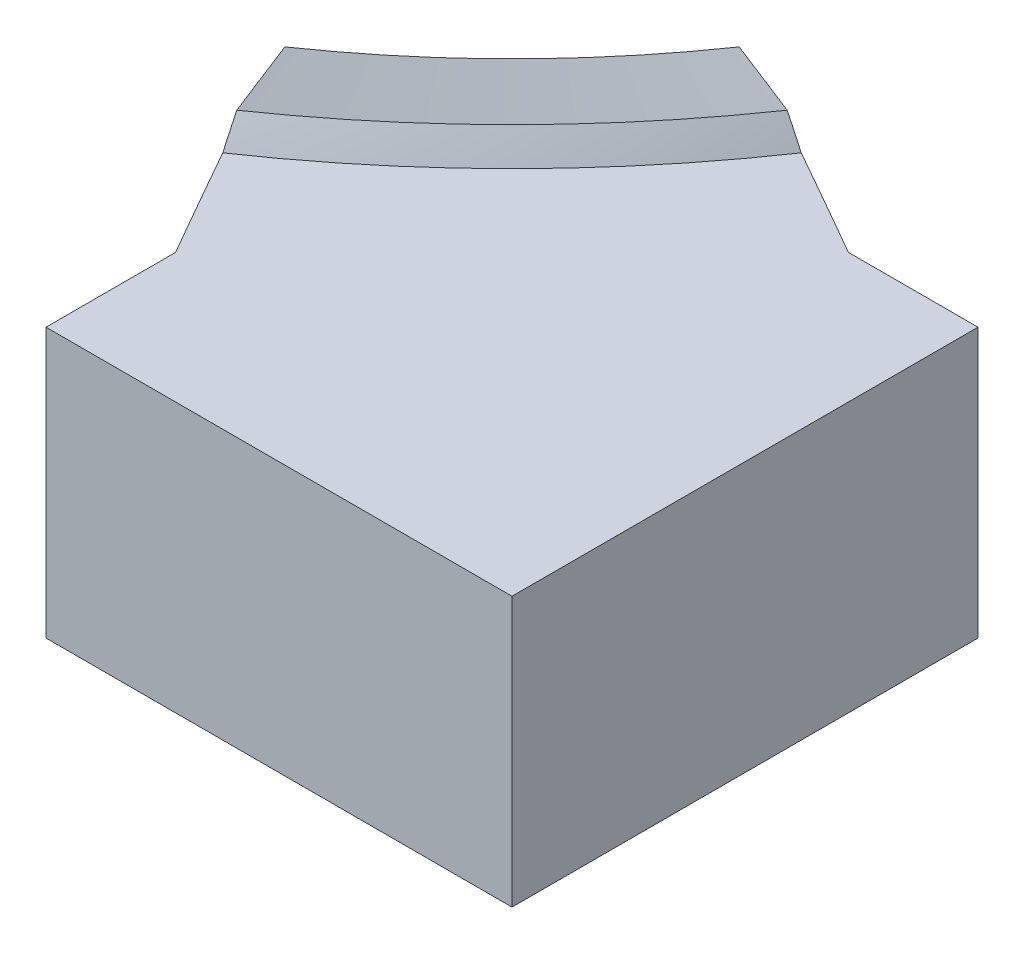
ISO-10303-21;
HEADER;
FILE_DESCRIPTION(('STEP AP214'),'2;1');
FILE_NAME('part.step','',(''),(''),'','','');
FILE_SCHEMA(('AUTOMOTIVE_DESIGN { 1 0 10303 214 1 1 1 1 }'));
ENDSEC;
DATA;
#1=APPLICATION_CONTEXT('core data for automotive mechanical design processes');
#2=APPLICATION_PROTOCOL_DEFINITION('international standard','automotive_design',2000,#1);
#3=PRODUCT_CONTEXT('',#1,'mechanical');
#4=PRODUCT('Part','Part','',(#3));
#5=PRODUCT_RELATED_PRODUCT_CATEGORY('part','',(#4));
#6=PRODUCT_DEFINITION_FORMATION('','',#4);
#7=PRODUCT_DEFINITION_CONTEXT('part definition',#1,'design');
#8=PRODUCT_DEFINITION('design','',#6,#7);
#9=PRODUCT_DEFINITION_SHAPE('','',#8);
#10=(LENGTH_UNIT() NAMED_UNIT(*) SI_UNIT(.MILLI.,.METRE.));
#11=(NAMED_UNIT(*) PLANE_ANGLE_UNIT() SI_UNIT($,.RADIAN.));
#12=(NAMED_UNIT(*) SI_UNIT($,.STERADIAN.) SOLID_ANGLE_UNIT());
#13=UNCERTAINTY_MEASURE_WITH_UNIT(LENGTH_MEASURE(1.E-05),#10,'distance_accuracy_value','');
#14=(GEOMETRIC_REPRESENTATION_CONTEXT(3) GLOBAL_UNCERTAINTY_ASSIGNED_CONTEXT((#13)) GLOBAL_UNIT_ASSIGNED_CONTEXT((#10,
#11,#12)) REPRESENTATION_CONTEXT('',''));
#15=CARTESIAN_POINT('',(0.,0.,0.));
#16=DIRECTION('',(0.,0.,1.));
#17=DIRECTION('',(1.,0.,0.));
#18=AXIS2_PLACEMENT_3D('',#15,#16,#17);
#19=CARTESIAN_POINT('',(32.5,11.7000000000001,0.));
#20=DIRECTION('',(0.,-1.,0.));
#21=DIRECTION('',(0.,0.,-1.));
#22=AXIS2_PLACEMENT_3D('',#19,#20,#21);
#23=PLANE('',#22);
#24=DIRECTION('',(0.,0.,-1.));
#25=VECTOR('',#24,1.);
#26=CARTESIAN_POINT('',(33.,11.7000000000001,-33.));
#27=LINE('',#26,#25);
#28=CARTESIAN_POINT('',(33.,11.7000000000001,33.));
#29=VERTEX_POINT('',#28);
#30=CARTESIAN_POINT('',(33.,11.7000000000001,19.5000000000001));
#31=VERTEX_POINT('',#30);
#32=EDGE_CURVE('E275',#29,#31,#27,.T.);
#33=ORIENTED_EDGE('',*,*,#32,.T.);
#34=DIRECTION('',(1.,0.,0.));
#35=VECTOR('',#34,1.);
#36=CARTESIAN_POINT('',(32.5,11.7000000000001,19.5000000000001));
#37=LINE('',#36,#35);
#38=CARTESIAN_POINT('',(29.2465382566893,11.7000000000001,19.5000000000001));
#39=VERTEX_POINT('',#38);
#40=EDGE_CURVE('E138',#39,#31,#37,.T.);
#41=ORIENTED_EDGE('',*,*,#40,.F.);
#42=CARTESIAN_POINT('',(1.68859662969362,11.7000000000001,7.31790114012991));
#43=CARTESIAN_POINT('',(1.87252860197762,11.7000000000001,7.33416074384991));
#44=CARTESIAN_POINT('',(2.05621891841642,11.7000000000001,7.35301284788605));
#45=CARTESIAN_POINT('',(2.42300448044872,11.7000000000001,7.39570336053311));
#46=CARTESIAN_POINT('',(2.60609977454128,11.7000000000001,7.41954135184829));
#47=CARTESIAN_POINT('',(3.15409688077382,11.7000000000001,7.49820148135874));
#48=CARTESIAN_POINT('',(3.51798669240142,11.7000000000001,7.56019481451234));
#49=CARTESIAN_POINT('',(4.24069608301457,11.7000000000001,7.7010197528768));
#50=CARTESIAN_POINT('',(4.59953131930248,11.7000000000001,7.7797722437193));
#51=CARTESIAN_POINT('',(5.3136431449388,11.7000000000001,7.9522122858681));
#52=CARTESIAN_POINT('',(5.66891905551187,11.7000000000001,8.04590263034534));
#53=CARTESIAN_POINT('',(6.37386719991572,11.7000000000001,8.24562306564878));
#54=CARTESIAN_POINT('',(6.72355942660548,11.7000000000001,8.35158308028888));
#55=CARTESIAN_POINT('',(7.4194166914267,11.7000000000001,8.57440344235992));
#56=CARTESIAN_POINT('',(7.765581891746,11.7000000000001,8.69126328603763));
#57=CARTESIAN_POINT('',(8.45509021413745,11.7000000000001,8.93442814934845));
#58=CARTESIAN_POINT('',(8.79842892377862,11.7000000000001,9.06074563825807));
#59=CARTESIAN_POINT('',(9.31115756218885,11.7000000000001,9.25614984584988));
#60=CARTESIAN_POINT('',(9.48168594069194,11.7000000000001,9.32227206217789));
#61=CARTESIAN_POINT('',(9.82202271662351,11.7000000000001,9.45634301137272));
#62=CARTESIAN_POINT('',(9.99183111630944,11.7000000000001,9.52429173850769));
#63=CARTESIAN_POINT('',(10.5619495090641,11.7000000000001,9.75571075274405));
#64=CARTESIAN_POINT('',(10.9606971840296,11.7000000000001,9.92303919520667));
#65=CARTESIAN_POINT('',(11.754849363323,11.7000000000001,10.2654699905591));
#66=CARTESIAN_POINT('',(12.150253680094,11.7000000000001,10.4405727761773));
#67=CARTESIAN_POINT('',(12.9382037530064,11.7000000000001,10.7972783679184));
#68=CARTESIAN_POINT('',(13.3307489558271,11.7000000000001,10.9788823939984));
#69=CARTESIAN_POINT('',(14.1132915297817,11.7000000000001,11.34750882738));
#70=CARTESIAN_POINT('',(14.5032888462196,11.7000000000001,11.5345313505367));
#71=CARTESIAN_POINT('',(15.2813567071964,11.7000000000001,11.913282258743));
#72=CARTESIAN_POINT('',(15.6694255535406,11.7000000000001,12.10501412728));
#73=CARTESIAN_POINT('',(16.443623847318,11.7000000000001,12.4923578434095));
#74=CARTESIAN_POINT('',(16.829753274669,11.7000000000001,12.687969731075));
#75=CARTESIAN_POINT('',(17.9855231881893,11.7000000000001,13.2797013350639));
#76=CARTESIAN_POINT('',(18.752635075581,11.7000000000001,13.6807610322329));
#77=CARTESIAN_POINT('',(20.2835257304401,11.7000000000001,14.4936042551411));
#78=CARTESIAN_POINT('',(21.0472918531971,11.7000000000001,14.9054114908331));
#79=CARTESIAN_POINT('',(22.5707726899078,11.7000000000001,15.736479888048));
#80=CARTESIAN_POINT('',(23.3304873190307,11.7000000000001,16.1557412048553));
#81=CARTESIAN_POINT('',(24.8463519872949,11.7000000000001,16.9998381066429));
#82=CARTESIAN_POINT('',(25.6025035011843,11.7000000000001,17.424671047491));
#83=CARTESIAN_POINT('',(27.1122242804787,11.7000000000001,18.2788837448426));
#84=CARTESIAN_POINT('',(27.8657935641776,11.7000000000001,18.7082634690459));
#85=CARTESIAN_POINT('',(29.3920564325115,11.7000000000001,19.5828284218626));
#86=CARTESIAN_POINT('',(30.1646902008871,11.7000000000001,20.0281179586167));
#87=CARTESIAN_POINT('',(31.708151818901,11.7000000000001,20.9218169061321));
#88=CARTESIAN_POINT('',(32.4789796655186,11.7000000000001,21.3702263221071));
#89=CARTESIAN_POINT('',(34.0192530824412,11.7000000000001,22.2696670117186));
#90=CARTESIAN_POINT('',(34.7886984365306,11.7000000000001,22.7206986554432));
#91=CARTESIAN_POINT('',(36.326341896421,11.7000000000001,23.6248832057995));
#92=CARTESIAN_POINT('',(37.094540001504,11.7000000000001,24.078036113652));
#93=CARTESIAN_POINT('',(38.6254534054425,11.7000000000001,24.9834986793613));
#94=CARTESIAN_POINT('',(39.3881747571644,11.7000000000001,25.4357981064243));
#95=CARTESIAN_POINT('',(40.9127329092829,11.7000000000001,26.3418856820324));
#96=CARTESIAN_POINT('',(41.6745697093054,11.7000000000001,26.7956738312069));
#97=CARTESIAN_POINT('',(43.1973567222083,11.7000000000001,27.7044428425147));
#98=CARTESIAN_POINT('',(43.9583070632214,11.7000000000001,28.159423489994));
#99=CARTESIAN_POINT('',(45.4795487528973,11.7000000000001,29.0704828047002));
#100=CARTESIAN_POINT('',(46.2398401024849,11.7000000000001,29.5265614703827));
#101=CARTESIAN_POINT('',(46.9998523165173,11.7000000000001,29.9831042332943));
#102=B_SPLINE_CURVE_WITH_KNOTS('',3,(#42,#43,#44,#45,#46,#47,#48,#49,#50,#51,#52,#53,#54,#55,
#56,#57,#58,#59,#60,#61,#62,#63,#64,#65,#66,#67,#68,#69,#70,#71,#72,#73,#74,#75,#76,#77,#78,#79,
#80,#81,#82,#83,#84,#85,#86,#87,#88,#89,#90,#91,#92,#93,#94,#95,#96,#97,#98,#99,#100,#101),
.UNSPECIFIED.,.F.,.F.,(4,2,2,2,2,2,2,2,2,2,2,2,2,2,2,2,2,2,2,2,2,2,2,2,2,2,2,2,2,4),(0.,
0.553907529583437,1.10776871820341,2.21465846164015,3.31643447993413,4.41841675716005,
5.51438978916932,6.61031219408693,7.70770584423091,8.25639448518369,8.80508140447518,
10.1022683738116,11.3995276367078,12.6970316194598,13.9945633651469,15.2930856540243,
16.5916213610612,19.1883928480791,21.7914801922247,24.394621827912,26.9965698391017,
29.5984993784052,32.2737869779754,34.9490790493939,37.6247583366482,40.3004391639493,
42.9606754751118,45.6209129109449,48.2807005198646,50.9404843901035),.UNSPECIFIED.);
#103=CARTESIAN_POINT('',(26.0657378281258,11.7000000000001,17.6869248733468));
#104=VERTEX_POINT('',#103);
#105=EDGE_CURVE('E133',#104,#39,#102,.T.);
#106=ORIENTED_EDGE('',*,*,#105,.F.);
#107=CARTESIAN_POINT('',(0.,11.7000000000001,0.));
#108=DIRECTION('',(0.,-1.,0.));
#109=DIRECTION('',(0.,0.,-1.));
#110=AXIS2_PLACEMENT_3D('',#107,#108,#109);
#111=CIRCLE('',#110,31.5);
#112=CARTESIAN_POINT('',(17.6869248733467,11.7000000000001,26.0657378281258));
#113=VERTEX_POINT('',#112);
#114=EDGE_CURVE('E45',#104,#113,#111,.T.);
#115=ORIENTED_EDGE('',*,*,#114,.T.);
#116=CARTESIAN_POINT('',(29.9831042332942,11.7000000000001,46.9998523165172));
#117=CARTESIAN_POINT('',(29.5695460419096,11.7000000000001,46.3114035057555));
#118=CARTESIAN_POINT('',(29.1563727624076,11.7000000000001,45.6227235286328));
#119=CARTESIAN_POINT('',(28.3309145968263,11.7000000000001,44.2448305512274));
#120=CARTESIAN_POINT('',(27.9186297115495,11.7000000000001,43.555617550464));
#121=CARTESIAN_POINT('',(26.6832428349779,11.7000000000001,41.4870015235794));
#122=CARTESIAN_POINT('',(25.8616526236678,11.7000000000001,40.1066946636882));
#123=CARTESIAN_POINT('',(24.2230959746683,11.7000000000001,37.3416252164109));
#124=CARTESIAN_POINT('',(23.4061344741696,11.7000000000001,35.9568597018244));
#125=CARTESIAN_POINT('',(21.7796223492399,11.7000000000001,33.1830492762636));
#126=CARTESIAN_POINT('',(20.970071426122,11.7000000000001,31.7940045408084));
#127=CARTESIAN_POINT('',(19.7705932500849,11.7000000000001,29.7178208854183));
#128=CARTESIAN_POINT('',(19.3766538702403,11.7000000000001,29.0330001316483));
#129=CARTESIAN_POINT('',(18.5918894504467,11.7000000000001,27.6615773365093));
#130=CARTESIAN_POINT('',(18.2010644029119,11.7000000000001,26.9749752994846));
#131=CARTESIAN_POINT('',(17.423168342795,11.7000000000001,25.5995290510725));
#132=CARTESIAN_POINT('',(17.036097821589,11.7000000000001,24.9106845615479));
#133=CARTESIAN_POINT('',(16.2666803040386,11.7000000000001,23.5303641361797));
#134=CARTESIAN_POINT('',(15.8843332831974,11.7000000000001,22.8388882140075));
#135=CARTESIAN_POINT('',(15.1254733333848,11.7000000000001,21.4524772962229));
#136=CARTESIAN_POINT('',(14.7489621260672,11.7000000000001,20.7575413568386));
#137=CARTESIAN_POINT('',(14.0035422153921,11.7000000000001,19.3635718196275));
#138=CARTESIAN_POINT('',(13.6346337030667,11.7000000000001,18.6645381194022));
#139=CARTESIAN_POINT('',(12.9068241377435,11.7000000000001,17.2614510623169));
#140=CARTESIAN_POINT('',(12.5479210327491,11.7000000000001,16.5573987724639));
#141=CARTESIAN_POINT('',(11.8433270003428,11.7000000000001,15.1427313714644));
#142=CARTESIAN_POINT('',(11.497635196273,11.7000000000001,14.4321166996746));
#143=CARTESIAN_POINT('',(10.9364574878759,11.7000000000001,13.240600979307));
#144=CARTESIAN_POINT('',(10.7159690889732,11.7000000000001,12.7620597933423));
#145=CARTESIAN_POINT('',(10.2849806158187,11.7000000000001,11.8004978032896));
#146=CARTESIAN_POINT('',(10.0744802539218,11.7000000000001,11.3174771286857));
#147=CARTESIAN_POINT('',(9.66645541430141,11.7000000000001,10.3472711456755));
#148=CARTESIAN_POINT('',(9.4689021222929,11.7000000000001,9.86009801543928));
#149=CARTESIAN_POINT('',(9.08946560082895,11.7000000000001,8.87955373046023));
#150=CARTESIAN_POINT('',(8.90758483272758,11.7000000000001,8.3861816160635));
#151=CARTESIAN_POINT('',(8.5624843162843,11.7000000000001,7.38905623057931));
#152=CARTESIAN_POINT('',(8.39940314340287,11.7000000000001,6.88525462559466));
#153=CARTESIAN_POINT('',(8.09868484115985,11.7000000000001,5.87024913974239));
#154=CARTESIAN_POINT('',(7.96103480095306,11.7000000000001,5.35904915780938));
#155=CARTESIAN_POINT('',(7.77767829893197,11.7000000000001,4.58476199325067));
#156=CARTESIAN_POINT('',(7.720241995675,11.7000000000001,4.32443264170045));
#157=CARTESIAN_POINT('',(7.61414186909903,11.7000000000001,3.80199727296307));
#158=CARTESIAN_POINT('',(7.5654774514676,11.7000000000001,3.53989137738966));
#159=CARTESIAN_POINT('',(7.47762859472269,11.7000000000001,3.01369854516661));
#160=CARTESIAN_POINT('',(7.43845788058526,11.7000000000001,2.74960930277732));
#161=CARTESIAN_POINT('',(7.37033995165896,11.7000000000001,2.22004865762173));
#162=CARTESIAN_POINT('',(7.34139544112448,11.7000000000001,1.95457690806531));
#163=CARTESIAN_POINT('',(7.31790114012981,11.7000000000001,1.68859662969376));
#164=B_SPLINE_CURVE_WITH_KNOTS('',3,(#116,#117,#118,#119,#120,#121,#122,#123,#124,#125,#126,
#127,#128,#129,#130,#131,#132,#133,#134,#135,#136,#137,#138,#139,#140,#141,#142,#143,#144,#145,
#146,#147,#148,#149,#150,#151,#152,#153,#154,#155,#156,#157,#158,#159,#160,#161,#162,#163),
.UNSPECIFIED.,.F.,.F.,(4,2,2,2,2,2,2,2,2,2,2,2,2,2,2,2,2,2,2,2,2,2,2,4),(0.,2.40934177011957,
4.81868571602445,9.63762980352724,14.4609978331241,19.2841705909017,21.6542928680232,
24.0244093702654,26.3948319875908,28.7652423064302,31.1363391094846,33.5074954184083,
35.8781617978656,38.2486705936817,39.8292635557093,41.4098109706272,42.9867121606657,
44.5638605517928,46.1519772751732,47.7392855165716,48.5389310863669,49.3385224582279,
50.1392629888806,50.9402151120507),.UNSPECIFIED.);
#165=CARTESIAN_POINT('',(19.5,11.7000000000001,29.2465382566894));
#166=VERTEX_POINT('',#165);
#167=EDGE_CURVE('E213',#166,#113,#164,.T.);
#168=ORIENTED_EDGE('',*,*,#167,.F.);
#169=DIRECTION('',(0.,0.,-1.));
#170=VECTOR('',#169,1.);
#171=CARTESIAN_POINT('',(19.5,11.7000000000001,0.));
#172=LINE('',#171,#170);
#173=CARTESIAN_POINT('',(19.5,11.7,33.));
#174=VERTEX_POINT('',#173);
#175=EDGE_CURVE('E151',#174,#166,#172,.T.);
#176=ORIENTED_EDGE('',*,*,#175,.F.);
#177=DIRECTION('',(-1.,0.,0.));
#178=VECTOR('',#177,1.);
#179=CARTESIAN_POINT('',(0.,11.7000000000001,33.));
#180=LINE('',#179,#178);
#181=EDGE_CURVE('E205',#29,#174,#180,.T.);
#182=ORIENTED_EDGE('',*,*,#181,.F.);
#183=EDGE_LOOP('',(#33,#41,#106,#115,#168,#176,#182));
#184=FACE_BOUND('',#183,.T.);
#185=ADVANCED_FACE('F41',(#184),#23,.F.);
#186=CARTESIAN_POINT('',(0.,0.,0.));
#187=DIRECTION('',(0.,-1.,0.));
#188=DIRECTION('',(1.,0.,0.));
#189=AXIS2_PLACEMENT_3D('',#186,#187,#188);
#190=SPHERICAL_SURFACE('',#189,33.6026784646701);
#191=ORIENTED_EDGE('',*,*,#114,.F.);
#192=CARTESIAN_POINT('',(0.,0.,17.6869248733468));
#193=DIRECTION('',(0.,0.,-1.));
#194=DIRECTION('',(0.,1.,0.));
#195=AXIS2_PLACEMENT_3D('',#192,#193,#194);
#196=CIRCLE('',#195,28.5711863338677);
#197=CARTESIAN_POINT('',(25.6591274592981,12.5666967239637,17.6869248733468));
#198=VERTEX_POINT('',#197);
#199=EDGE_CURVE('E143',#198,#104,#196,.T.);
#200=ORIENTED_EDGE('',*,*,#199,.F.);
#201=CARTESIAN_POINT('',(0.,12.5666967239637,0.));
#202=DIRECTION('',(0.,-1.,0.));
#203=DIRECTION('',(0.,0.,-1.));
#204=AXIS2_PLACEMENT_3D('',#201,#202,#203);
#205=CIRCLE('',#204,31.1643728229516);
#206=CARTESIAN_POINT('',(17.6869248733467,12.5666967239637,25.6591274592982));
#207=VERTEX_POINT('',#206);
#208=EDGE_CURVE('E156',#198,#207,#205,.T.);
#209=ORIENTED_EDGE('',*,*,#208,.T.);
#210=CARTESIAN_POINT('',(17.6869248733468,0.,0.));
#211=DIRECTION('',(-1.,0.,0.));
#212=DIRECTION('',(0.,-1.,0.));
#213=AXIS2_PLACEMENT_3D('',#210,#211,#212);
#214=CIRCLE('',#213,28.5711863338677);
#215=EDGE_CURVE('E152',#113,#207,#214,.T.);
#216=ORIENTED_EDGE('',*,*,#215,.F.);
#217=EDGE_LOOP('',(#191,#200,#209,#216));
#218=FACE_BOUND('',#217,.T.);
#219=ADVANCED_FACE('F155',(#218),#190,.T.);
#220=CARTESIAN_POINT('',(0.,10.3743688599618,0.));
#221=DIRECTION('',(0.,1.,0.));
#222=DIRECTION('',(0.,0.,1.));
#223=AXIS2_PLACEMENT_3D('',#220,#221,#222);
#224=CONICAL_SURFACE('',#223,25.7275802907014,1.18750065982306);
#225=ORIENTED_EDGE('',*,*,#208,.F.);
#226=DIRECTION('',(0.763603636129072,0.373979018880187,0.526354614616298));
#227=VECTOR('',#226,1.);
#228=CARTESIAN_POINT('',(0.,0.,0.));
#229=LINE('',#228,#227);
#230=CARTESIAN_POINT('',(21.1827546040733,10.3743688599618,14.6013456570995));
#231=VERTEX_POINT('',#230);
#232=EDGE_CURVE('E147',#231,#198,#229,.T.);
#233=ORIENTED_EDGE('',*,*,#232,.F.);
#234=CARTESIAN_POINT('',(0.,10.3743688599618,0.));
#235=DIRECTION('',(0.,-1.,0.));
#236=DIRECTION('',(0.,0.,-1.));
#237=AXIS2_PLACEMENT_3D('',#234,#235,#236);
#238=CIRCLE('',#237,25.7275802907014);
#239=CARTESIAN_POINT('',(14.6013456570994,10.3743688599618,21.1827546040733));
#240=VERTEX_POINT('',#239);
#241=EDGE_CURVE('E157',#231,#240,#238,.T.);
#242=ORIENTED_EDGE('',*,*,#241,.T.);
#243=DIRECTION('',(0.526354614616296,0.373979018880187,0.763603636129074));
#244=VECTOR('',#243,1.);
#245=CARTESIAN_POINT('',(0.,0.,0.));
#246=LINE('',#245,#244);
#247=EDGE_CURVE('E307',#207,#240,#246,.F.);
#248=ORIENTED_EDGE('',*,*,#247,.F.);
#249=EDGE_LOOP('',(#225,#233,#242,#248));
#250=FACE_BOUND('',#249,.T.);
#251=ADVANCED_FACE('F209',(#250),#224,.F.);
#252=CARTESIAN_POINT('',(0.,0.,0.));
#253=DIRECTION('',(0.,-1.,0.));
#254=DIRECTION('',(1.,0.,0.));
#255=AXIS2_PLACEMENT_3D('',#252,#253,#254);
#256=SPHERICAL_SURFACE('',#255,27.7405103928719);
#257=ORIENTED_EDGE('',*,*,#241,.F.);
#258=CARTESIAN_POINT('',(0.,0.,14.6013456570995));
#259=DIRECTION('',(0.,0.,-1.));
#260=DIRECTION('',(0.,1.,0.));
#261=AXIS2_PLACEMENT_3D('',#258,#259,#260);
#262=CIRCLE('',#261,23.5867891383913);
#263=CARTESIAN_POINT('',(23.4683824983538,2.36043317420627,14.6013456570995));
#264=VERTEX_POINT('',#263);
#265=EDGE_CURVE('E306',#264,#231,#262,.F.);
#266=ORIENTED_EDGE('',*,*,#265,.F.);
#267=CARTESIAN_POINT('',(0.,2.36043317420627,0.));
#268=DIRECTION('',(0.,-1.,0.));
#269=DIRECTION('',(0.,0.,-1.));
#270=AXIS2_PLACEMENT_3D('',#267,#268,#269);
#271=CIRCLE('',#270,27.6399036193533);
#272=CARTESIAN_POINT('',(14.6013456570994,2.36043317420627,23.4683824983539));
#273=VERTEX_POINT('',#272);
#274=EDGE_CURVE('E254',#264,#273,#271,.T.);
#275=ORIENTED_EDGE('',*,*,#274,.T.);
#276=CARTESIAN_POINT('',(14.6013456570995,0.,0.));
#277=DIRECTION('',(-1.,0.,0.));
#278=DIRECTION('',(0.,-1.,0.));
#279=AXIS2_PLACEMENT_3D('',#276,#277,#278);
#280=CIRCLE('',#279,23.5867891383913);
#281=EDGE_CURVE('E293',#240,#273,#280,.F.);
#282=ORIENTED_EDGE('',*,*,#281,.F.);
#283=EDGE_LOOP('',(#257,#266,#275,#282));
#284=FACE_BOUND('',#283,.T.);
#285=ADVANCED_FACE('F211',(#284),#256,.F.);
#286=CARTESIAN_POINT('',(32.5000000000001,3.90000000000005,0.));
#287=DIRECTION('',(0.,-1.,0.));
#288=DIRECTION('',(0.,0.,-1.));
#289=AXIS2_PLACEMENT_3D('',#286,#287,#288);
#290=PLANE('',#289);
#291=DIRECTION('',(0.,0.,-1.));
#292=VECTOR('',#291,1.);
#293=CARTESIAN_POINT('',(33.,3.90000000000006,-33.));
#294=LINE('',#293,#292);
#295=CARTESIAN_POINT('',(33.,3.90000000000006,33.));
#296=VERTEX_POINT('',#295);
#297=CARTESIAN_POINT('',(33.,3.90000000000006,19.5000000000001));
#298=VERTEX_POINT('',#297);
#299=EDGE_CURVE('E282',#296,#298,#294,.T.);
#300=ORIENTED_EDGE('',*,*,#299,.F.);
#301=DIRECTION('',(-1.,0.,0.));
#302=VECTOR('',#301,1.);
#303=CARTESIAN_POINT('',(0.,3.90000000000005,33.));
#304=LINE('',#303,#302);
#305=CARTESIAN_POINT('',(19.5,3.90000000000005,33.));
#306=VERTEX_POINT('',#305);
#307=EDGE_CURVE('E266',#296,#306,#304,.T.);
#308=ORIENTED_EDGE('',*,*,#307,.T.);
#309=DIRECTION('',(0.,0.,-1.));
#310=VECTOR('',#309,1.);
#311=CARTESIAN_POINT('',(19.5,3.90000000000005,0.));
#312=LINE('',#311,#310);
#313=CARTESIAN_POINT('',(19.5,3.90000000000005,31.2576390663146));
#314=VERTEX_POINT('',#313);
#315=EDGE_CURVE('E238',#306,#314,#312,.T.);
#316=ORIENTED_EDGE('',*,*,#315,.T.);
#317=CARTESIAN_POINT('',(26.981632298887,3.90000000000005,43.410879280691));
#318=CARTESIAN_POINT('',(26.1079588700875,3.90000000000005,41.9938382880044));
#319=CARTESIAN_POINT('',(25.2345013435676,3.90000000000005,40.576663996944));
#320=CARTESIAN_POINT('',(23.4882737650834,3.90000000000005,37.7419020872876));
#321=CARTESIAN_POINT('',(22.6155037095799,3.90000000000005,36.3243144708717));
#322=CARTESIAN_POINT('',(20.8709210600193,3.90000000000005,33.4886024943368));
#323=CARTESIAN_POINT('',(19.9991084409297,3.90000000000005,32.0704781496204));
#324=CARTESIAN_POINT('',(18.256847910122,3.90000000000005,29.2333806526732));
#325=CARTESIAN_POINT('',(17.3864000056548,3.90000000000005,27.8144074959875));
#326=CARTESIAN_POINT('',(16.0823163404525,3.90000000000005,25.6849295437214));
#327=CARTESIAN_POINT('',(15.647876369202,3.90000000000005,24.974917283884));
#328=CARTESIAN_POINT('',(14.7796918509744,3.90000000000005,23.5544684540386));
#329=CARTESIAN_POINT('',(14.3459473034086,3.90000000000005,22.8440318843905));
#330=CARTESIAN_POINT('',(13.4793719578897,3.90000000000005,21.422614494192));
#331=CARTESIAN_POINT('',(13.0465411478755,3.90000000000005,20.7116336809963));
#332=CARTESIAN_POINT('',(12.182098353347,3.90000000000005,19.2889280552639));
#333=CARTESIAN_POINT('',(11.7504863726865,3.90000000000005,18.5772032403845));
#334=CARTESIAN_POINT('',(10.8889370785867,3.90000000000005,17.1526941527402));
#335=CARTESIAN_POINT('',(10.4589998457121,3.90000000000005,16.4399098312314));
#336=CARTESIAN_POINT('',(9.60156393048008,3.90000000000005,15.0128821247618));
#337=CARTESIAN_POINT('',(9.17406522692966,3.90000000000005,14.2986387525548));
#338=CARTESIAN_POINT('',(8.53560197710837,3.90000000000005,13.2255923954237));
#339=CARTESIAN_POINT('',(8.32323983628905,3.90000000000005,12.8676212298307));
#340=CARTESIAN_POINT('',(7.8997080584052,3.90000000000005,12.1509755139606));
#341=CARTESIAN_POINT('',(7.68853841724979,3.90000000000005,11.792300966102));
#342=CARTESIAN_POINT('',(7.26770931672158,3.90000000000005,11.0740513729932));
#343=CARTESIAN_POINT('',(7.05804990234182,3.90000000000005,10.714476301341));
#344=CARTESIAN_POINT('',(6.64077224921907,3.90000000000005,9.99413869080626));
#345=CARTESIAN_POINT('',(6.43315403474698,3.90000000000005,9.63337613787198));
#346=CARTESIAN_POINT('',(6.22682125004522,3.90000000000005,9.27187532338227));
#347=B_SPLINE_CURVE_WITH_KNOTS('',3,(#317,#318,#319,#320,#321,#322,#323,#324,#325,#326,#327,
#328,#329,#330,#331,#332,#333,#334,#335,#336,#337,#338,#339,#340,#341,#342,#343,#344,#345,#346),
.UNSPECIFIED.,.F.,.F.,(4,2,2,2,2,2,2,2,2,2,2,2,2,2,4),(0.,4.9941762265666,9.98832657213658,
14.9823430770962,19.9763860263468,22.4735239949208,24.9706598486392,27.4677625324719,
29.9648731031794,32.4621023511511,34.9593098629344,36.2079750776802,37.4566360062806,
38.7053339826941,39.9540467888454),.UNSPECIFIED.);
#348=CARTESIAN_POINT('',(16.7067641155646,3.90000000000005,26.7045695113568));
#349=VERTEX_POINT('',#348);
#350=EDGE_CURVE('E232',#314,#349,#347,.T.);
#351=ORIENTED_EDGE('',*,*,#350,.T.);
#352=CARTESIAN_POINT('',(0.,3.90000000000005,0.));
#353=DIRECTION('',(0.,-1.,0.));
#354=DIRECTION('',(0.,0.,-1.));
#355=AXIS2_PLACEMENT_3D('',#352,#353,#354);
#356=CIRCLE('',#355,31.5000000000001);
#357=CARTESIAN_POINT('',(26.7045695113568,3.90000000000005,16.7067641155646));
#358=VERTEX_POINT('',#357);
#359=EDGE_CURVE('E59',#358,#349,#356,.T.);
#360=ORIENTED_EDGE('',*,*,#359,.F.);
#361=CARTESIAN_POINT('',(9.27187532338219,3.90000000000005,6.22682125004521));
#362=CARTESIAN_POINT('',(9.46865755464488,3.90000000000005,6.33911442385818));
#363=CARTESIAN_POINT('',(9.66521223472995,3.90000000000005,6.45180523324382));
#364=CARTESIAN_POINT('',(10.0579250053345,3.90000000000005,6.67787433186965));
#365=CARTESIAN_POINT('',(10.2540830972433,3.90000000000005,6.79125261869596));
#366=CARTESIAN_POINT('',(10.8420470204068,3.90000000000005,7.13225511808675));
#367=CARTESIAN_POINT('',(11.23334782513,3.90000000000005,7.36075001649359));
#368=CARTESIAN_POINT('',(12.0149229892081,3.90000000000005,7.81945506454851));
#369=CARTESIAN_POINT('',(12.4051973839792,3.90000000000005,8.04966515393501));
#370=CARTESIAN_POINT('',(13.1849646909858,3.90000000000005,8.5114078802232));
#371=CARTESIAN_POINT('',(13.5744576001055,3.90000000000005,8.7429405223838));
#372=CARTESIAN_POINT('',(14.7419914476931,3.90000000000005,9.43904743227588));
#373=CARTESIAN_POINT('',(15.5191207313141,3.90000000000005,9.90515025763181));
#374=CARTESIAN_POINT('',(17.0718204469447,3.90000000000005,10.839960715885));
#375=CARTESIAN_POINT('',(17.8473908611933,3.90000000000005,11.3086683782338));
#376=CARTESIAN_POINT('',(19.6586536838533,3.90000000000005,12.4061109557522));
#377=CARTESIAN_POINT('',(20.6939237069235,3.90000000000005,13.0355427676126));
#378=CARTESIAN_POINT('',(22.7632425451251,3.90000000000005,14.2964107181018));
#379=CARTESIAN_POINT('',(23.7972913592427,3.90000000000005,14.9278468583933));
#380=CARTESIAN_POINT('',(25.8645517885905,3.90000000000005,16.1920818773198));
#381=CARTESIAN_POINT('',(26.8977634059545,3.90000000000005,16.8248807524666));
#382=CARTESIAN_POINT('',(28.9635952711735,3.90000000000005,18.0914431125257));
#383=CARTESIAN_POINT('',(29.9962155189469,3.90000000000005,18.7252065975711));
#384=CARTESIAN_POINT('',(32.0611051200552,3.90000000000005,19.9934930450059));
#385=CARTESIAN_POINT('',(33.0933744380205,3.90000000000005,20.6280160649726));
#386=CARTESIAN_POINT('',(35.157584332286,3.90000000000005,21.8975968666628));
#387=CARTESIAN_POINT('',(36.1895249085409,3.90000000000005,22.5326546484599));
#388=CARTESIAN_POINT('',(38.2531488906748,3.90000000000005,23.8031803133091));
#389=CARTESIAN_POINT('',(39.2848322973847,3.90000000000005,24.438648195012));
#390=CARTESIAN_POINT('',(41.3479956634306,3.90000000000005,25.7099135864412));
#391=CARTESIAN_POINT('',(42.3794756228159,3.90000000000005,26.3457110960874));
#392=CARTESIAN_POINT('',(43.410879280691,3.90000000000005,26.9816322988871));
#393=B_SPLINE_CURVE_WITH_KNOTS('',3,(#361,#362,#363,#364,#365,#366,#367,#368,#369,#370,#371,
#372,#373,#374,#375,#376,#377,#378,#379,#380,#381,#382,#383,#384,#385,#386,#387,#388,#389,#390,
#391,#392),.UNSPECIFIED.,.F.,.F.,(4,2,2,2,2,2,2,2,2,2,2,2,2,2,2,4),(0.,0.679702326643713,
1.3594022680788,2.7187837433135,4.07811768112561,5.43745702787191,8.15602003639927,
10.8746138450005,14.5094021413489,18.1441934533842,21.7789754724495,25.4137579937189,
29.0488361386287,32.6839147836405,36.3189815280115,39.9540473897858),.UNSPECIFIED.);
#394=CARTESIAN_POINT('',(31.2576390663146,3.90000000000005,19.5000000000001));
#395=VERTEX_POINT('',#394);
#396=EDGE_CURVE('E159',#358,#395,#393,.T.);
#397=ORIENTED_EDGE('',*,*,#396,.T.);
#398=DIRECTION('',(1.,0.,0.));
#399=VECTOR('',#398,1.);
#400=CARTESIAN_POINT('',(32.5000000000001,3.90000000000005,19.5000000000001));
#401=LINE('',#400,#399);
#402=EDGE_CURVE('E170',#395,#298,#401,.T.);
#403=ORIENTED_EDGE('',*,*,#402,.T.);
#404=EDGE_LOOP('',(#300,#308,#316,#351,#360,#397,#403));
#405=FACE_BOUND('',#404,.T.);
#406=ADVANCED_FACE('F172',(#405),#290,.T.);
#407=CARTESIAN_POINT('',(19.4999999999999,32.5,0.));
#408=DIRECTION('',(-1.,0.,0.));
#409=DIRECTION('',(0.,0.,-1.));
#410=AXIS2_PLACEMENT_3D('',#407,#408,#409);
#411=PLANE('',#410);
#412=ORIENTED_EDGE('',*,*,#315,.F.);
#413=DIRECTION('',(0.,1.,0.));
#414=VECTOR('',#413,1.);
#415=CARTESIAN_POINT('',(19.5000000000001,0.,33.));
#416=LINE('',#415,#414);
#417=EDGE_CURVE('E269',#306,#174,#416,.T.);
#418=ORIENTED_EDGE('',*,*,#417,.T.);
#419=ORIENTED_EDGE('',*,*,#175,.T.);
#420=CARTESIAN_POINT('',(19.5,0.,0.));
#421=DIRECTION('',(1.,0.,0.));
#422=DIRECTION('',(0.,0.,-1.));
#423=AXIS2_PLACEMENT_3D('',#420,#421,#422);
#424=CIRCLE('',#423,31.4999999999999);
#425=EDGE_CURVE('E11',#166,#314,#424,.T.);
#426=ORIENTED_EDGE('',*,*,#425,.T.);
#427=EDGE_LOOP('',(#412,#418,#419,#426));
#428=FACE_BOUND('',#427,.T.);
#429=ADVANCED_FACE('F222',(#428),#411,.T.);
#430=CARTESIAN_POINT('',(13.5486364278669,0.,0.));
#431=DIRECTION('',(1.,0.,0.));
#432=DIRECTION('',(0.,0.,1.));
#433=AXIS2_PLACEMENT_3D('',#430,#431,#432);
#434=CONICAL_SURFACE('',#433,21.8862588450156,1.01648883059334);
#435=CARTESIAN_POINT('',(24.8011031541808,2.36043317420627,39.9937245464798));
#436=CARTESIAN_POINT('',(24.0512747995102,2.36043317420627,38.7803446115436));
#437=CARTESIAN_POINT('',(23.3015229149317,2.36043317420627,37.5669173991451));
#438=CARTESIAN_POINT('',(21.8022498437714,2.36043317420627,35.1399211144635));
#439=CARTESIAN_POINT('',(21.0527286571003,2.36043317420627,33.9263520422357));
#440=CARTESIAN_POINT('',(19.5539961645206,2.36043317420627,31.4990270418376));
#441=CARTESIAN_POINT('',(18.8047848577878,2.36043317420627,30.2852711141763));
#442=CARTESIAN_POINT('',(17.3068000141458,2.36043317420627,27.857488409065));
#443=CARTESIAN_POINT('',(16.5580264774201,2.36043317420627,26.6434616315017));
#444=CARTESIAN_POINT('',(15.0611285097934,2.36043317420627,24.2150008856621));
#445=CARTESIAN_POINT('',(14.3130040816391,2.36043317420627,23.0005669156926));
#446=CARTESIAN_POINT('',(12.8177734965329,2.36043317420627,20.5710735887598));
#447=CARTESIAN_POINT('',(12.0706673385902,2.36043317420627,19.3560142324065));
#448=CARTESIAN_POINT('',(10.951334575524,2.36043317420627,17.5326073416469));
#449=CARTESIAN_POINT('',(10.578443967322,2.36043317420627,16.9246674831929));
#450=CARTESIAN_POINT('',(9.83327851220865,2.36043317420627,15.7084108964553));
#451=CARTESIAN_POINT('',(9.46100366496131,2.36043317420627,15.1000941683775));
#452=CARTESIAN_POINT('',(8.71731898611144,2.36043317420627,13.8829290094769));
#453=CARTESIAN_POINT('',(8.34590915748662,2.36043317420627,13.2740805768336));
#454=CARTESIAN_POINT('',(7.78976255798648,2.36043317420627,12.3602178829223));
#455=CARTESIAN_POINT('',(7.60454154550687,2.36043317420627,12.0554983636333));
#456=CARTESIAN_POINT('',(7.23450991285466,2.36043317420627,11.4458100205214));
#457=CARTESIAN_POINT('',(7.04969929293434,2.36043317420627,11.1408411965452));
#458=CARTESIAN_POINT('',(6.86513776470055,2.36043317420627,10.8357215029914));
#459=B_SPLINE_CURVE_WITH_KNOTS('',3,(#435,#436,#437,#438,#439,#440,#441,#442,#443,#444,#445,
#446,#447,#448,#449,#450,#451,#452,#453,#454,#455,#456,#457,#458),.UNSPECIFIED.,.F.,.F.,(4,2,2,
2,2,2,2,2,2,2,2,4),(0.,4.27911218230018,8.55822270549597,12.8373217708467,17.1164226271796,
21.3955415022916,25.6746562108054,27.8142223728062,29.9537873670591,32.0933597156334,
33.163147857496,34.2329366568243),.UNSPECIFIED.);
#460=CARTESIAN_POINT('',(15.654054886332,2.36043317420627,25.176911630983));
#461=VERTEX_POINT('',#460);
#462=EDGE_CURVE('E226',#461,#273,#459,.T.);
#463=ORIENTED_EDGE('',*,*,#462,.F.);
#464=CARTESIAN_POINT('',(15.654054886332,0.,0.));
#465=DIRECTION('',(-1.,0.,0.));
#466=DIRECTION('',(0.,-1.,0.));
#467=AXIS2_PLACEMENT_3D('',#464,#465,#466);
#468=CIRCLE('',#467,25.287319431767);
#469=CARTESIAN_POINT('',(15.654054886332,6.60300212355853,24.4100161204475));
#470=VERTEX_POINT('',#469);
#471=EDGE_CURVE('E252',#470,#461,#468,.F.);
#472=ORIENTED_EDGE('',*,*,#471,.F.);
#473=DIRECTION('',(0.526354614616296,0.222020470944612,0.820766550337953));
#474=VECTOR('',#473,1.);
#475=CARTESIAN_POINT('',(0.,0.,0.));
#476=LINE('',#475,#474);
#477=CARTESIAN_POINT('',(16.7067641155646,7.04704306544776,26.0515492211234));
#478=VERTEX_POINT('',#477);
#479=EDGE_CURVE('E247',#478,#470,#476,.F.);
#480=ORIENTED_EDGE('',*,*,#479,.F.);
#481=CARTESIAN_POINT('',(16.7067641155646,0.,0.));
#482=DIRECTION('',(-1.,0.,0.));
#483=DIRECTION('',(0.,-1.,0.));
#484=AXIS2_PLACEMENT_3D('',#481,#482,#483);
#485=CIRCLE('',#484,26.9878497251428);
#486=EDGE_CURVE('E243',#349,#478,#485,.T.);
#487=ORIENTED_EDGE('',*,*,#486,.F.);
#488=ORIENTED_EDGE('',*,*,#350,.F.);
#489=ORIENTED_EDGE('',*,*,#425,.F.);
#490=ORIENTED_EDGE('',*,*,#167,.T.);
#491=ORIENTED_EDGE('',*,*,#215,.T.);
#492=ORIENTED_EDGE('',*,*,#247,.T.);
#493=ORIENTED_EDGE('',*,*,#281,.T.);
#494=EDGE_LOOP('',(#463,#472,#480,#487,#488,#489,#490,#491,#492,#493));
#495=FACE_BOUND('',#494,.T.);
#496=ADVANCED_FACE('F219',(#495),#434,.T.);
#497=CARTESIAN_POINT('',(0.,0.,0.));
#498=DIRECTION('',(0.,-1.,0.));
#499=DIRECTION('',(1.,0.,0.));
#500=AXIS2_PLACEMENT_3D('',#497,#498,#499);
#501=SPHERICAL_SURFACE('',#500,31.7405103928719);
#502=ORIENTED_EDGE('',*,*,#359,.T.);
#503=ORIENTED_EDGE('',*,*,#486,.T.);
#504=CARTESIAN_POINT('',(0.,7.04704306544776,0.));
#505=DIRECTION('',(0.,-1.,0.));
#506=DIRECTION('',(0.,0.,-1.));
#507=AXIS2_PLACEMENT_3D('',#504,#505,#506);
#508=CIRCLE('',#507,30.9483308763773);
#509=CARTESIAN_POINT('',(26.0515492211233,7.04704306544776,16.7067641155647));
#510=VERTEX_POINT('',#509);
#511=EDGE_CURVE('E290',#510,#478,#508,.T.);
#512=ORIENTED_EDGE('',*,*,#511,.F.);
#513=CARTESIAN_POINT('',(0.,0.,16.7067641155646));
#514=DIRECTION('',(0.,0.,-1.));
#515=DIRECTION('',(0.,1.,0.));
#516=AXIS2_PLACEMENT_3D('',#513,#514,#515);
#517=CIRCLE('',#516,26.9878497251428);
#518=EDGE_CURVE('E241',#510,#358,#517,.T.);
#519=ORIENTED_EDGE('',*,*,#518,.T.);
#520=EDGE_LOOP('',(#502,#503,#512,#519));
#521=FACE_BOUND('',#520,.T.);
#522=ADVANCED_FACE('F181',(#521),#501,.F.);
#523=CARTESIAN_POINT('',(0.,0.,13.5486364278669));
#524=DIRECTION('',(0.,0.,1.));
#525=DIRECTION('',(0.,-1.,0.));
#526=AXIS2_PLACEMENT_3D('',#523,#524,#525);
#527=CONICAL_SURFACE('',#526,21.8862588450156,1.01648883059334);
#528=CARTESIAN_POINT('',(10.8357215029913,2.36043317420627,6.86513776470053));
#529=CARTESIAN_POINT('',(11.2630925597176,2.36043317420627,7.12366176808169));
#530=CARTESIAN_POINT('',(11.6901776505371,2.36043317420627,7.38265757852894));
#531=CARTESIAN_POINT('',(12.5438979374666,2.36043317420627,7.90138867208216));
#532=CARTESIAN_POINT('',(12.970533134086,2.36043317420627,8.16112395434987));
#533=CARTESIAN_POINT('',(13.8234754515046,2.36043317420627,8.6811297137011));
#534=CARTESIAN_POINT('',(14.2497825732131,2.36043317420627,8.94140018929398));
#535=CARTESIAN_POINT('',(15.1021429610876,2.36043317420627,9.46235675172611));
#536=CARTESIAN_POINT('',(15.5281962271704,2.36043317420627,9.72304283870147));
#537=CARTESIAN_POINT('',(16.8060588971724,2.36043317420627,10.505579081987));
#538=CARTESIAN_POINT('',(17.6575743701329,2.36043317420627,11.0279091720098));
#539=CARTESIAN_POINT('',(19.360100704316,2.36043317420627,12.0733923954325));
#540=CARTESIAN_POINT('',(20.2111115650924,2.36043317420627,12.5965455295588));
#541=CARTESIAN_POINT('',(22.6408785628903,2.36043317420627,14.0913192450879));
#542=CARTESIAN_POINT('',(24.2192179304129,2.36043317420627,15.0636172109287));
#543=CARTESIAN_POINT('',(27.3752603205835,2.36043317420627,17.0092439052066));
#544=CARTESIAN_POINT('',(28.9529633434066,2.36043317420627,17.9825726333597));
#545=CARTESIAN_POINT('',(32.107987127397,2.36043317420627,19.9298678577189));
#546=CARTESIAN_POINT('',(33.685307886522,2.36043317420627,20.9038343572336));
#547=CARTESIAN_POINT('',(36.8396840067684,2.36043317420627,22.8521971478645));
#548=CARTESIAN_POINT('',(38.4167393678827,2.36043317420627,23.8265934389923));
#549=CARTESIAN_POINT('',(39.9937245464798,2.36043317420627,24.8011031541808));
#550=B_SPLINE_CURVE_WITH_KNOTS('',3,(#528,#529,#530,#531,#532,#533,#534,#535,#536,#537,#538,
#539,#540,#541,#542,#543,#544,#545,#546,#547,#548,#549),.UNSPECIFIED.,.F.,.F.,(4,2,2,2,2,2,2,2,
2,2,4),(0.,1.49844023879212,2.99687877961776,4.49531315259141,5.99374801635271,8.99060650672547,
11.9874676432788,17.5488214503847,23.1101737262181,28.671555086653,34.2329365965412),.UNSPECIFIED.);
#551=CARTESIAN_POINT('',(25.176911630983,2.36043317420627,15.6540548863321));
#552=VERTEX_POINT('',#551);
#553=EDGE_CURVE('E189',#264,#552,#550,.T.);
#554=ORIENTED_EDGE('',*,*,#553,.F.);
#555=ORIENTED_EDGE('',*,*,#265,.T.);
#556=ORIENTED_EDGE('',*,*,#232,.T.);
#557=ORIENTED_EDGE('',*,*,#199,.T.);
#558=ORIENTED_EDGE('',*,*,#105,.T.);
#559=CARTESIAN_POINT('',(0.,0.,19.5));
#560=DIRECTION('',(0.,0.,-1.));
#561=DIRECTION('',(0.,1.,0.));
#562=AXIS2_PLACEMENT_3D('',#559,#560,#561);
#563=CIRCLE('',#562,31.4999999999999);
#564=EDGE_CURVE('E51',#39,#395,#563,.T.);
#565=ORIENTED_EDGE('',*,*,#564,.T.);
#566=ORIENTED_EDGE('',*,*,#396,.F.);
#567=ORIENTED_EDGE('',*,*,#518,.F.);
#568=DIRECTION('',(0.820766550337952,0.222020470944612,0.526354614616298));
#569=VECTOR('',#568,1.);
#570=CARTESIAN_POINT('',(0.,0.,0.));
#571=LINE('',#570,#569);
#572=CARTESIAN_POINT('',(24.4100161204475,6.60300212355853,15.6540548863321));
#573=VERTEX_POINT('',#572);
#574=EDGE_CURVE('E245',#573,#510,#571,.T.);
#575=ORIENTED_EDGE('',*,*,#574,.F.);
#576=CARTESIAN_POINT('',(0.,0.,15.654054886332));
#577=DIRECTION('',(0.,0.,-1.));
#578=DIRECTION('',(0.,1.,0.));
#579=AXIS2_PLACEMENT_3D('',#576,#577,#578);
#580=CIRCLE('',#579,25.287319431767);
#581=EDGE_CURVE('E250',#552,#573,#580,.F.);
#582=ORIENTED_EDGE('',*,*,#581,.F.);
#583=EDGE_LOOP('',(#554,#555,#556,#557,#558,#565,#566,#567,#575,#582));
#584=FACE_BOUND('',#583,.T.);
#585=ADVANCED_FACE('F145',(#584),#527,.T.);
#586=CARTESIAN_POINT('',(32.4999999999999,0.,19.5000000000001));
#587=DIRECTION('',(0.,0.,-1.));
#588=DIRECTION('',(0.,1.,0.));
#589=AXIS2_PLACEMENT_3D('',#586,#587,#588);
#590=PLANE('',#589);
#591=DIRECTION('',(0.,1.,0.));
#592=VECTOR('',#591,1.);
#593=CARTESIAN_POINT('',(33.,-33.0000000000002,19.4999999999999));
#594=LINE('',#593,#592);
#595=EDGE_CURVE('E279',#298,#31,#594,.T.);
#596=ORIENTED_EDGE('',*,*,#595,.F.);
#597=ORIENTED_EDGE('',*,*,#402,.F.);
#598=ORIENTED_EDGE('',*,*,#564,.F.);
#599=ORIENTED_EDGE('',*,*,#40,.T.);
#600=EDGE_LOOP('',(#596,#597,#598,#599));
#601=FACE_BOUND('',#600,.T.);
#602=ADVANCED_FACE('F180',(#601),#590,.T.);
#603=CARTESIAN_POINT('',(0.,6.60300212355853,0.));
#604=DIRECTION('',(0.,1.,0.));
#605=DIRECTION('',(0.,0.,1.));
#606=AXIS2_PLACEMENT_3D('',#603,#604,#605);
#607=CONICAL_SURFACE('',#606,28.9982468674367,1.34691015484274);
#608=ORIENTED_EDGE('',*,*,#511,.T.);
#609=ORIENTED_EDGE('',*,*,#479,.T.);
#610=CARTESIAN_POINT('',(0.,6.60300212355853,0.));
#611=DIRECTION('',(0.,-1.,0.));
#612=DIRECTION('',(0.,0.,-1.));
#613=AXIS2_PLACEMENT_3D('',#610,#611,#612);
#614=CIRCLE('',#613,28.9982468674367);
#615=EDGE_CURVE('E288',#573,#470,#614,.T.);
#616=ORIENTED_EDGE('',*,*,#615,.F.);
#617=ORIENTED_EDGE('',*,*,#574,.T.);
#618=EDGE_LOOP('',(#608,#609,#616,#617));
#619=FACE_BOUND('',#618,.T.);
#620=ADVANCED_FACE('F324',(#619),#607,.T.);
#621=CARTESIAN_POINT('',(27.6399036193533,2.36043317420627,0.));
#622=DIRECTION('',(0.,-1.,0.));
#623=DIRECTION('',(0.,0.,-1.));
#624=AXIS2_PLACEMENT_3D('',#621,#622,#623);
#625=PLANE('',#624);
#626=CARTESIAN_POINT('',(0.,2.36043317420627,0.));
#627=DIRECTION('',(0.,-1.,0.));
#628=DIRECTION('',(0.,0.,-1.));
#629=AXIS2_PLACEMENT_3D('',#626,#627,#628);
#630=CIRCLE('',#629,29.6466914453978);
#631=EDGE_CURVE('E286',#552,#461,#630,.T.);
#632=ORIENTED_EDGE('',*,*,#631,.T.);
#633=ORIENTED_EDGE('',*,*,#462,.T.);
#634=ORIENTED_EDGE('',*,*,#274,.F.);
#635=ORIENTED_EDGE('',*,*,#553,.T.);
#636=EDGE_LOOP('',(#632,#633,#634,#635));
#637=FACE_BOUND('',#636,.T.);
#638=ADVANCED_FACE('F182',(#637),#625,.T.);
#639=CARTESIAN_POINT('',(0.,0.,0.));
#640=DIRECTION('',(0.,-1.,0.));
#641=DIRECTION('',(1.,0.,0.));
#642=AXIS2_PLACEMENT_3D('',#639,#640,#641);
#643=SPHERICAL_SURFACE('',#642,29.7405103928719);
#644=ORIENTED_EDGE('',*,*,#615,.T.);
#645=ORIENTED_EDGE('',*,*,#471,.T.);
#646=ORIENTED_EDGE('',*,*,#631,.F.);
#647=ORIENTED_EDGE('',*,*,#581,.T.);
#648=EDGE_LOOP('',(#644,#645,#646,#647));
#649=FACE_BOUND('',#648,.T.);
#650=ADVANCED_FACE('F183',(#649),#643,.T.);
#651=CARTESIAN_POINT('',(33.,-33.,-33.));
#652=DIRECTION('',(1.,0.,0.));
#653=DIRECTION('',(0.,0.,-1.));
#654=AXIS2_PLACEMENT_3D('',#651,#652,#653);
#655=PLANE('',#654);
#656=ORIENTED_EDGE('',*,*,#32,.F.);
#657=DIRECTION('',(0.,1.,0.));
#658=VECTOR('',#657,1.);
#659=CARTESIAN_POINT('',(33.,-33.,33.));
#660=LINE('',#659,#658);
#661=EDGE_CURVE('E283',#296,#29,#660,.T.);
#662=ORIENTED_EDGE('',*,*,#661,.F.);
#663=ORIENTED_EDGE('',*,*,#299,.T.);
#664=ORIENTED_EDGE('',*,*,#595,.T.);
#665=EDGE_LOOP('',(#656,#662,#663,#664));
#666=FACE_BOUND('',#665,.T.);
#667=ADVANCED_FACE('F302',(#666),#655,.T.);
#668=CARTESIAN_POINT('',(0.,0.,33.));
#669=DIRECTION('',(0.,0.,-1.));
#670=DIRECTION('',(-1.,0.,0.));
#671=AXIS2_PLACEMENT_3D('',#668,#669,#670);
#672=PLANE('',#671);
#673=ORIENTED_EDGE('',*,*,#661,.T.);
#674=ORIENTED_EDGE('',*,*,#181,.T.);
#675=ORIENTED_EDGE('',*,*,#417,.F.);
#676=ORIENTED_EDGE('',*,*,#307,.F.);
#677=EDGE_LOOP('',(#673,#674,#675,#676));
#678=FACE_BOUND('',#677,.T.);
#679=ADVANCED_FACE('F43',(#678),#672,.F.);
#680=CLOSED_SHELL('',(#185,#219,#251,#285,#406,#429,#496,#522,#585,#602,#620,#638,#650,#667,#679));
#681=MANIFOLD_SOLID_BREP('B2',#680);
#682=ADVANCED_BREP_SHAPE_REPRESENTATION('',(#18,#681),#14);
#683=SHAPE_DEFINITION_REPRESENTATION(#9,#682);
ENDSEC;
END-ISO-10303-21;
